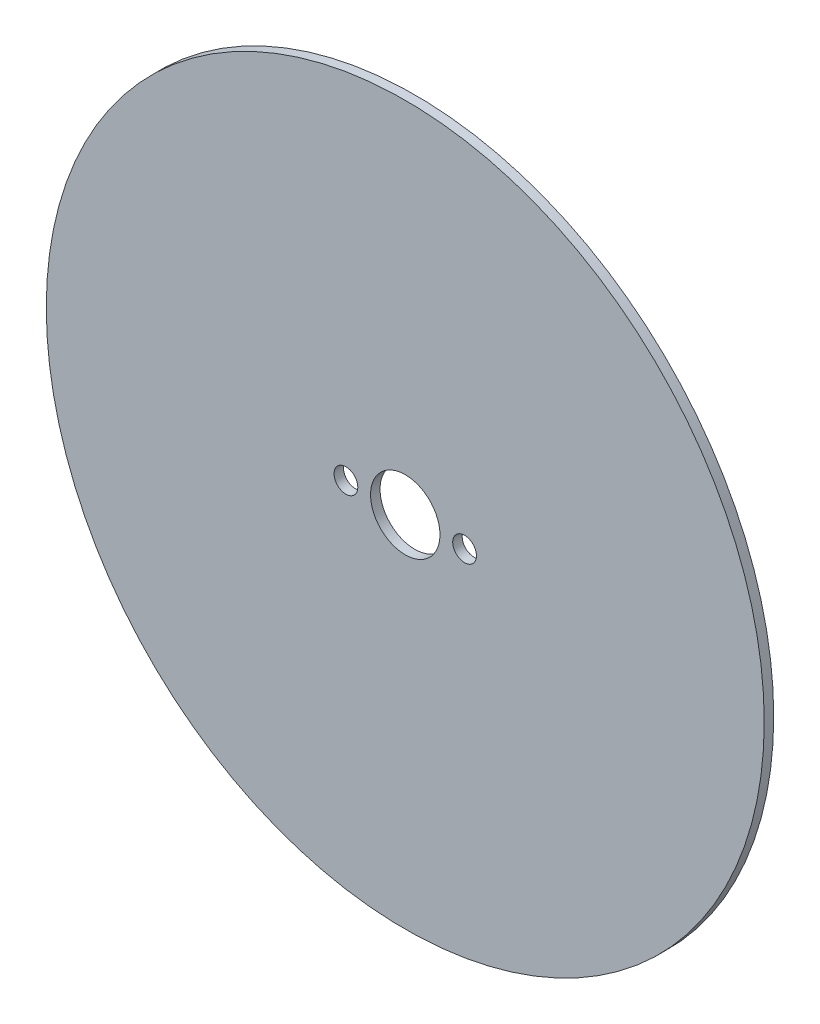
ISO-10303-21;
HEADER;
FILE_DESCRIPTION(('STEP AP214'),'2;1');
FILE_NAME('part.step','',(''),(''),'','','');
FILE_SCHEMA(('AUTOMOTIVE_DESIGN { 1 0 10303 214 1 1 1 1 }'));
ENDSEC;
DATA;
#1=APPLICATION_CONTEXT('core data for automotive mechanical design processes');
#2=APPLICATION_PROTOCOL_DEFINITION('international standard','automotive_design',2000,#1);
#3=PRODUCT_CONTEXT('',#1,'mechanical');
#4=PRODUCT('Part','Part','',(#3));
#5=PRODUCT_RELATED_PRODUCT_CATEGORY('part','',(#4));
#6=PRODUCT_DEFINITION_FORMATION('','',#4);
#7=PRODUCT_DEFINITION_CONTEXT('part definition',#1,'design');
#8=PRODUCT_DEFINITION('design','',#6,#7);
#9=PRODUCT_DEFINITION_SHAPE('','',#8);
#10=(LENGTH_UNIT() NAMED_UNIT(*) SI_UNIT(.MILLI.,.METRE.));
#11=(NAMED_UNIT(*) PLANE_ANGLE_UNIT() SI_UNIT($,.RADIAN.));
#12=(NAMED_UNIT(*) SI_UNIT($,.STERADIAN.) SOLID_ANGLE_UNIT());
#13=UNCERTAINTY_MEASURE_WITH_UNIT(LENGTH_MEASURE(1.E-05),#10,'distance_accuracy_value','');
#14=(GEOMETRIC_REPRESENTATION_CONTEXT(3) GLOBAL_UNCERTAINTY_ASSIGNED_CONTEXT((#13)) GLOBAL_UNIT_ASSIGNED_CONTEXT((#10,
#11,#12)) REPRESENTATION_CONTEXT('',''));
#15=CARTESIAN_POINT('',(0.,0.,0.));
#16=DIRECTION('',(0.,0.,1.));
#17=DIRECTION('',(1.,0.,0.));
#18=AXIS2_PLACEMENT_3D('',#15,#16,#17);
#19=CARTESIAN_POINT('',(-5.,0.,-0.8));
#20=DIRECTION('',(0.,0.,1.));
#21=DIRECTION('',(1.,0.,0.));
#22=AXIS2_PLACEMENT_3D('',#19,#20,#21);
#23=CYLINDRICAL_SURFACE('',#22,1.);
#24=CARTESIAN_POINT('',(-5.,0.,-0.8));
#25=DIRECTION('',(0.,0.,1.));
#26=DIRECTION('',(1.,0.,0.));
#27=AXIS2_PLACEMENT_3D('',#24,#25,#26);
#28=CIRCLE('',#27,1.);
#29=CARTESIAN_POINT('',(-4.,0.,-0.8));
#30=VERTEX_POINT('',#29);
#31=EDGE_CURVE('E42',#30,#30,#28,.T.);
#32=ORIENTED_EDGE('',*,*,#31,.F.);
#33=EDGE_LOOP('',(#32));
#34=FACE_BOUND('',#33,.T.);
#35=CARTESIAN_POINT('',(-5.,0.,0.));
#36=DIRECTION('',(0.,0.,1.));
#37=DIRECTION('',(1.,0.,0.));
#38=AXIS2_PLACEMENT_3D('',#35,#36,#37);
#39=CIRCLE('',#38,1.);
#40=CARTESIAN_POINT('',(-4.,0.,0.));
#41=VERTEX_POINT('',#40);
#42=EDGE_CURVE('E56',#41,#41,#39,.T.);
#43=ORIENTED_EDGE('',*,*,#42,.T.);
#44=EDGE_LOOP('',(#43));
#45=FACE_BOUND('',#44,.T.);
#46=ADVANCED_FACE('F34',(#34,#45),#23,.F.);
#47=CARTESIAN_POINT('',(5.,0.,-0.8));
#48=DIRECTION('',(0.,0.,1.));
#49=DIRECTION('',(1.,0.,0.));
#50=AXIS2_PLACEMENT_3D('',#47,#48,#49);
#51=CYLINDRICAL_SURFACE('',#50,1.);
#52=CARTESIAN_POINT('',(5.,0.,-0.8));
#53=DIRECTION('',(0.,0.,1.));
#54=DIRECTION('',(1.,0.,0.));
#55=AXIS2_PLACEMENT_3D('',#52,#53,#54);
#56=CIRCLE('',#55,1.);
#57=CARTESIAN_POINT('',(6.,0.,-0.8));
#58=VERTEX_POINT('',#57);
#59=EDGE_CURVE('E47',#58,#58,#56,.T.);
#60=ORIENTED_EDGE('',*,*,#59,.F.);
#61=EDGE_LOOP('',(#60));
#62=FACE_BOUND('',#61,.T.);
#63=CARTESIAN_POINT('',(5.,0.,0.));
#64=DIRECTION('',(0.,0.,1.));
#65=DIRECTION('',(1.,0.,0.));
#66=AXIS2_PLACEMENT_3D('',#63,#64,#65);
#67=CIRCLE('',#66,1.);
#68=CARTESIAN_POINT('',(6.,0.,0.));
#69=VERTEX_POINT('',#68);
#70=EDGE_CURVE('E54',#69,#69,#67,.T.);
#71=ORIENTED_EDGE('',*,*,#70,.T.);
#72=EDGE_LOOP('',(#71));
#73=FACE_BOUND('',#72,.T.);
#74=ADVANCED_FACE('F74',(#62,#73),#51,.F.);
#75=CARTESIAN_POINT('',(0.,0.,-0.8));
#76=DIRECTION('',(0.,0.,1.));
#77=DIRECTION('',(1.,0.,0.));
#78=AXIS2_PLACEMENT_3D('',#75,#76,#77);
#79=CYLINDRICAL_SURFACE('',#78,2.925);
#80=CARTESIAN_POINT('',(0.,0.,-0.8));
#81=DIRECTION('',(0.,0.,1.));
#82=DIRECTION('',(1.,0.,0.));
#83=AXIS2_PLACEMENT_3D('',#80,#81,#82);
#84=CIRCLE('',#83,2.925);
#85=CARTESIAN_POINT('',(2.925,0.,-0.8));
#86=VERTEX_POINT('',#85);
#87=EDGE_CURVE('E61',#86,#86,#84,.T.);
#88=ORIENTED_EDGE('',*,*,#87,.F.);
#89=EDGE_LOOP('',(#88));
#90=FACE_BOUND('',#89,.T.);
#91=CARTESIAN_POINT('',(0.,0.,0.));
#92=DIRECTION('',(0.,0.,1.));
#93=DIRECTION('',(1.,0.,0.));
#94=AXIS2_PLACEMENT_3D('',#91,#92,#93);
#95=CIRCLE('',#94,2.925);
#96=CARTESIAN_POINT('',(2.925,0.,0.));
#97=VERTEX_POINT('',#96);
#98=EDGE_CURVE('E51',#97,#97,#95,.T.);
#99=ORIENTED_EDGE('',*,*,#98,.T.);
#100=EDGE_LOOP('',(#99));
#101=FACE_BOUND('',#100,.T.);
#102=ADVANCED_FACE('F36',(#90,#101),#79,.F.);
#103=CARTESIAN_POINT('',(0.,0.,-0.8));
#104=DIRECTION('',(0.,0.,1.));
#105=DIRECTION('',(1.,0.,0.));
#106=AXIS2_PLACEMENT_3D('',#103,#104,#105);
#107=CYLINDRICAL_SURFACE('',#106,30.2538897565406);
#108=CARTESIAN_POINT('',(0.,0.,-0.8));
#109=DIRECTION('',(0.,0.,1.));
#110=DIRECTION('',(1.,0.,0.));
#111=AXIS2_PLACEMENT_3D('',#108,#109,#110);
#112=CIRCLE('',#111,30.2538897565406);
#113=CARTESIAN_POINT('',(30.2538897565406,0.,-0.8));
#114=VERTEX_POINT('',#113);
#115=EDGE_CURVE('E10',#114,#114,#112,.T.);
#116=ORIENTED_EDGE('',*,*,#115,.T.);
#117=EDGE_LOOP('',(#116));
#118=FACE_BOUND('',#117,.T.);
#119=CARTESIAN_POINT('',(0.,0.,0.));
#120=DIRECTION('',(0.,0.,1.));
#121=DIRECTION('',(1.,0.,0.));
#122=AXIS2_PLACEMENT_3D('',#119,#120,#121);
#123=CIRCLE('',#122,30.2538897565406);
#124=CARTESIAN_POINT('',(30.2538897565406,0.,0.));
#125=VERTEX_POINT('',#124);
#126=EDGE_CURVE('E38',#125,#125,#123,.T.);
#127=ORIENTED_EDGE('',*,*,#126,.F.);
#128=EDGE_LOOP('',(#127));
#129=FACE_BOUND('',#128,.T.);
#130=ADVANCED_FACE('F87',(#118,#129),#107,.T.);
#131=CARTESIAN_POINT('',(0.,0.,-0.8));
#132=DIRECTION('',(0.,0.,1.));
#133=DIRECTION('',(1.,0.,0.));
#134=AXIS2_PLACEMENT_3D('',#131,#132,#133);
#135=PLANE('',#134);
#136=ORIENTED_EDGE('',*,*,#87,.T.);
#137=EDGE_LOOP('',(#136));
#138=FACE_BOUND('',#137,.T.);
#139=ORIENTED_EDGE('',*,*,#59,.T.);
#140=EDGE_LOOP('',(#139));
#141=FACE_BOUND('',#140,.T.);
#142=ORIENTED_EDGE('',*,*,#31,.T.);
#143=EDGE_LOOP('',(#142));
#144=FACE_BOUND('',#143,.T.);
#145=ORIENTED_EDGE('',*,*,#115,.F.);
#146=EDGE_LOOP('',(#145));
#147=FACE_BOUND('',#146,.T.);
#148=ADVANCED_FACE('F71',(#138,#141,#144,#147),#135,.F.);
#149=CARTESIAN_POINT('',(0.,0.,0.));
#150=DIRECTION('',(0.,0.,1.));
#151=DIRECTION('',(1.,0.,0.));
#152=AXIS2_PLACEMENT_3D('',#149,#150,#151);
#153=PLANE('',#152);
#154=ORIENTED_EDGE('',*,*,#98,.F.);
#155=EDGE_LOOP('',(#154));
#156=FACE_BOUND('',#155,.T.);
#157=ORIENTED_EDGE('',*,*,#70,.F.);
#158=EDGE_LOOP('',(#157));
#159=FACE_BOUND('',#158,.T.);
#160=ORIENTED_EDGE('',*,*,#42,.F.);
#161=EDGE_LOOP('',(#160));
#162=FACE_BOUND('',#161,.T.);
#163=ORIENTED_EDGE('',*,*,#126,.T.);
#164=EDGE_LOOP('',(#163));
#165=FACE_BOUND('',#164,.T.);
#166=ADVANCED_FACE('F79',(#156,#159,#162,#165),#153,.T.);
#167=CLOSED_SHELL('',(#46,#74,#102,#130,#148,#166));
#168=MANIFOLD_SOLID_BREP('B2',#167);
#169=ADVANCED_BREP_SHAPE_REPRESENTATION('',(#18,#168),#14);
#170=SHAPE_DEFINITION_REPRESENTATION(#9,#169);
ENDSEC;
END-ISO-10303-21;
